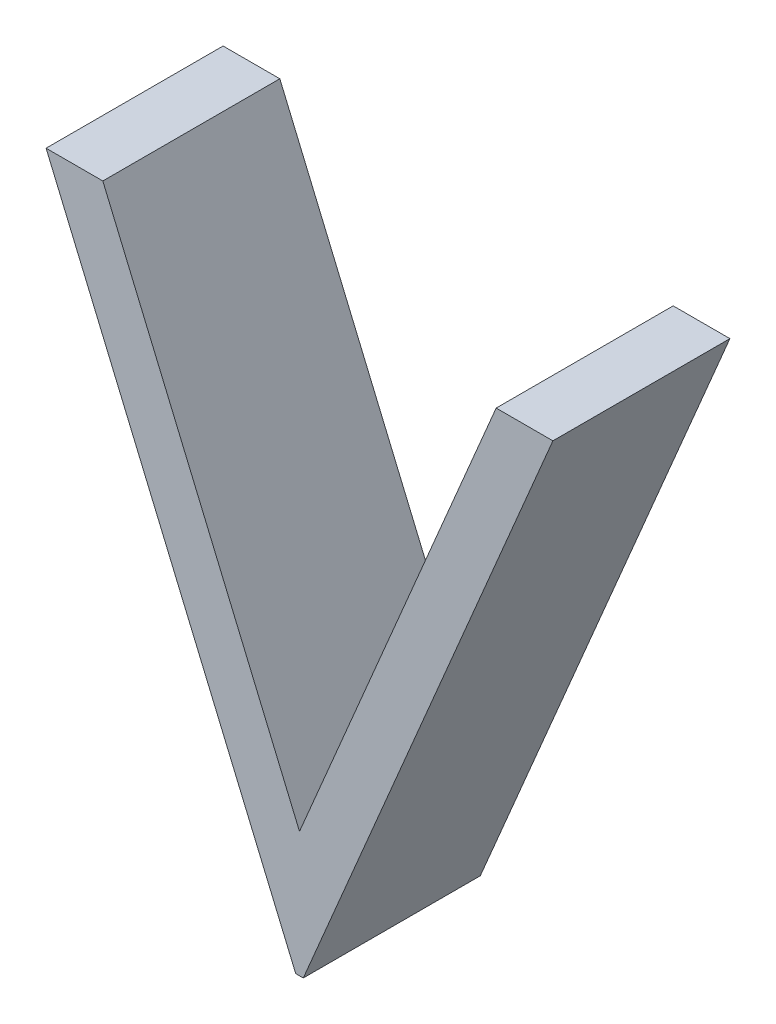
ISO-10303-21;
HEADER;
FILE_DESCRIPTION(('STEP AP214'),'2;1');
FILE_NAME('part.step','',(''),(''),'','','');
FILE_SCHEMA(('AUTOMOTIVE_DESIGN { 1 0 10303 214 1 1 1 1 }'));
ENDSEC;
DATA;
#1=APPLICATION_CONTEXT('core data for automotive mechanical design processes');
#2=APPLICATION_PROTOCOL_DEFINITION('international standard','automotive_design',2000,#1);
#3=PRODUCT_CONTEXT('',#1,'mechanical');
#4=PRODUCT('Part','Part','',(#3));
#5=PRODUCT_RELATED_PRODUCT_CATEGORY('part','',(#4));
#6=PRODUCT_DEFINITION_FORMATION('','',#4);
#7=PRODUCT_DEFINITION_CONTEXT('part definition',#1,'design');
#8=PRODUCT_DEFINITION('design','',#6,#7);
#9=PRODUCT_DEFINITION_SHAPE('','',#8);
#10=(LENGTH_UNIT() NAMED_UNIT(*) SI_UNIT(.MILLI.,.METRE.));
#11=(NAMED_UNIT(*) PLANE_ANGLE_UNIT() SI_UNIT($,.RADIAN.));
#12=(NAMED_UNIT(*) SI_UNIT($,.STERADIAN.) SOLID_ANGLE_UNIT());
#13=UNCERTAINTY_MEASURE_WITH_UNIT(LENGTH_MEASURE(1.E-05),#10,'distance_accuracy_value','');
#14=(GEOMETRIC_REPRESENTATION_CONTEXT(3) GLOBAL_UNCERTAINTY_ASSIGNED_CONTEXT((#13)) GLOBAL_UNIT_ASSIGNED_CONTEXT((#10,
#11,#12)) REPRESENTATION_CONTEXT('',''));
#15=CARTESIAN_POINT('',(0.,0.,0.));
#16=DIRECTION('',(0.,0.,1.));
#17=DIRECTION('',(1.,0.,0.));
#18=AXIS2_PLACEMENT_3D('',#15,#16,#17);
#19=CARTESIAN_POINT('',(-53.7016960951003,-22.8701190762308,1.5));
#20=DIRECTION('',(-0.920967251068559,-0.389639990836697,0.));
#21=DIRECTION('',(0.389639990836697,-0.920967251068559,0.));
#22=AXIS2_PLACEMENT_3D('',#19,#20,#21);
#23=PLANE('',#22);
#24=DIRECTION('',(-0.389639990836697,0.920967251068559,0.));
#25=VECTOR('',#24,1.);
#26=CARTESIAN_POINT('',(-53.7016960951003,-22.8701190762308,0.));
#27=LINE('',#26,#25);
#28=CARTESIAN_POINT('',(-53.7016960951003,-22.8701190762308,0.));
#29=VERTEX_POINT('',#28);
#30=CARTESIAN_POINT('',(-55.8170807104849,-17.8701190762308,0.));
#31=VERTEX_POINT('',#30);
#32=EDGE_CURVE('E124',#29,#31,#27,.T.);
#33=ORIENTED_EDGE('',*,*,#32,.F.);
#34=DIRECTION('',(0.,0.,-1.));
#35=VECTOR('',#34,1.);
#36=CARTESIAN_POINT('',(-53.7016960951003,-22.8701190762308,1.5));
#37=LINE('',#36,#35);
#38=CARTESIAN_POINT('',(-53.7016960951003,-22.8701190762308,1.5));
#39=VERTEX_POINT('',#38);
#40=EDGE_CURVE('E11',#39,#29,#37,.T.);
#41=ORIENTED_EDGE('',*,*,#40,.F.);
#42=DIRECTION('',(-0.389639990836697,0.920967251068559,0.));
#43=VECTOR('',#42,1.);
#44=CARTESIAN_POINT('',(-53.7016960951003,-22.8701190762308,1.5));
#45=LINE('',#44,#43);
#46=CARTESIAN_POINT('',(-55.8170807104849,-17.8701190762308,1.5));
#47=VERTEX_POINT('',#46);
#48=EDGE_CURVE('E141',#39,#47,#45,.T.);
#49=ORIENTED_EDGE('',*,*,#48,.T.);
#50=DIRECTION('',(0.,0.,-1.));
#51=VECTOR('',#50,1.);
#52=CARTESIAN_POINT('',(-55.8170807104849,-17.8701190762308,1.5));
#53=LINE('',#52,#51);
#54=EDGE_CURVE('E36',#47,#31,#53,.T.);
#55=ORIENTED_EDGE('',*,*,#54,.T.);
#56=EDGE_LOOP('',(#33,#41,#49,#55));
#57=FACE_BOUND('',#56,.T.);
#58=ADVANCED_FACE('F33',(#57),#23,.T.);
#59=CARTESIAN_POINT('',(-53.6375935309977,-22.8701190762308,1.5));
#60=DIRECTION('',(0.,-1.,0.));
#61=DIRECTION('',(0.,0.,-1.));
#62=AXIS2_PLACEMENT_3D('',#59,#60,#61);
#63=PLANE('',#62);
#64=DIRECTION('',(-1.,0.,0.));
#65=VECTOR('',#64,1.);
#66=CARTESIAN_POINT('',(-53.6375935309977,-22.8701190762308,0.));
#67=LINE('',#66,#65);
#68=CARTESIAN_POINT('',(-53.6375935309977,-22.8701190762308,0.));
#69=VERTEX_POINT('',#68);
#70=EDGE_CURVE('E139',#69,#29,#67,.T.);
#71=ORIENTED_EDGE('',*,*,#70,.F.);
#72=DIRECTION('',(0.,0.,-1.));
#73=VECTOR('',#72,1.);
#74=CARTESIAN_POINT('',(-53.6375935309977,-22.8701190762308,1.5));
#75=LINE('',#74,#73);
#76=CARTESIAN_POINT('',(-53.6375935309977,-22.8701190762308,1.5));
#77=VERTEX_POINT('',#76);
#78=EDGE_CURVE('E42',#77,#69,#75,.T.);
#79=ORIENTED_EDGE('',*,*,#78,.F.);
#80=DIRECTION('',(-1.,0.,0.));
#81=VECTOR('',#80,1.);
#82=CARTESIAN_POINT('',(-53.6375935309977,-22.8701190762308,1.5));
#83=LINE('',#82,#81);
#84=EDGE_CURVE('E114',#77,#39,#83,.T.);
#85=ORIENTED_EDGE('',*,*,#84,.T.);
#86=ORIENTED_EDGE('',*,*,#40,.T.);
#87=EDGE_LOOP('',(#71,#79,#85,#86));
#88=FACE_BOUND('',#87,.T.);
#89=ADVANCED_FACE('F151',(#88),#63,.T.);
#90=CARTESIAN_POINT('',(-51.5222089156131,-17.8701190762308,1.5));
#91=DIRECTION('',(0.920967251068559,-0.389639990836698,0.));
#92=DIRECTION('',(0.389639990836698,0.920967251068559,0.));
#93=AXIS2_PLACEMENT_3D('',#90,#91,#92);
#94=PLANE('',#93);
#95=DIRECTION('',(-0.389639990836698,-0.920967251068559,0.));
#96=VECTOR('',#95,1.);
#97=CARTESIAN_POINT('',(-51.5222089156131,-17.8701190762308,0.));
#98=LINE('',#97,#96);
#99=CARTESIAN_POINT('',(-51.5222089156131,-17.8701190762308,0.));
#100=VERTEX_POINT('',#99);
#101=EDGE_CURVE('E101',#100,#69,#98,.T.);
#102=ORIENTED_EDGE('',*,*,#101,.F.);
#103=DIRECTION('',(0.,0.,-1.));
#104=VECTOR('',#103,1.);
#105=CARTESIAN_POINT('',(-51.5222089156131,-17.8701190762308,1.5));
#106=LINE('',#105,#104);
#107=CARTESIAN_POINT('',(-51.5222089156131,-17.8701190762308,1.5));
#108=VERTEX_POINT('',#107);
#109=EDGE_CURVE('E96',#108,#100,#106,.T.);
#110=ORIENTED_EDGE('',*,*,#109,.F.);
#111=DIRECTION('',(-0.389639990836698,-0.920967251068559,0.));
#112=VECTOR('',#111,1.);
#113=CARTESIAN_POINT('',(-51.5222089156131,-17.8701190762308,1.5));
#114=LINE('',#113,#112);
#115=EDGE_CURVE('E99',#108,#77,#114,.T.);
#116=ORIENTED_EDGE('',*,*,#115,.T.);
#117=ORIENTED_EDGE('',*,*,#78,.T.);
#118=EDGE_LOOP('',(#102,#110,#116,#117));
#119=FACE_BOUND('',#118,.T.);
#120=ADVANCED_FACE('F98',(#119),#94,.T.);
#121=CARTESIAN_POINT('',(-52.0029781463824,-17.8701190762308,1.5));
#122=DIRECTION('',(0.,1.,0.));
#123=DIRECTION('',(0.,0.,1.));
#124=AXIS2_PLACEMENT_3D('',#121,#122,#123);
#125=PLANE('',#124);
#126=DIRECTION('',(1.,0.,0.));
#127=VECTOR('',#126,1.);
#128=CARTESIAN_POINT('',(-52.0029781463824,-17.8701190762308,0.));
#129=LINE('',#128,#127);
#130=CARTESIAN_POINT('',(-52.0029781463824,-17.8701190762308,0.));
#131=VERTEX_POINT('',#130);
#132=EDGE_CURVE('E136',#131,#100,#129,.T.);
#133=ORIENTED_EDGE('',*,*,#132,.F.);
#134=DIRECTION('',(0.,0.,-1.));
#135=VECTOR('',#134,1.);
#136=CARTESIAN_POINT('',(-52.0029781463824,-17.8701190762308,1.5));
#137=LINE('',#136,#135);
#138=CARTESIAN_POINT('',(-52.0029781463824,-17.8701190762308,1.5));
#139=VERTEX_POINT('',#138);
#140=EDGE_CURVE('E106',#139,#131,#137,.T.);
#141=ORIENTED_EDGE('',*,*,#140,.F.);
#142=DIRECTION('',(1.,0.,0.));
#143=VECTOR('',#142,1.);
#144=CARTESIAN_POINT('',(-52.0029781463824,-17.8701190762308,1.5));
#145=LINE('',#144,#143);
#146=EDGE_CURVE('E112',#139,#108,#145,.T.);
#147=ORIENTED_EDGE('',*,*,#146,.T.);
#148=ORIENTED_EDGE('',*,*,#109,.T.);
#149=EDGE_LOOP('',(#133,#141,#147,#148));
#150=FACE_BOUND('',#149,.T.);
#151=ADVANCED_FACE('F116',(#150),#125,.T.);
#152=CARTESIAN_POINT('',(-53.669644813049,-21.8104235634103,1.5));
#153=DIRECTION('',(-0.920999559573797,0.389563616454195,0.));
#154=DIRECTION('',(-0.389563616454195,-0.920999559573798,0.));
#155=AXIS2_PLACEMENT_3D('',#152,#153,#154);
#156=PLANE('',#155);
#157=DIRECTION('',(0.389563616454195,0.920999559573797,0.));
#158=VECTOR('',#157,1.);
#159=CARTESIAN_POINT('',(-53.669644813049,-21.8104235634103,0.));
#160=LINE('',#159,#158);
#161=CARTESIAN_POINT('',(-53.669644813049,-21.8104235634103,0.));
#162=VERTEX_POINT('',#161);
#163=EDGE_CURVE('E133',#162,#131,#160,.T.);
#164=ORIENTED_EDGE('',*,*,#163,.F.);
#165=DIRECTION('',(0.,0.,-1.));
#166=VECTOR('',#165,1.);
#167=CARTESIAN_POINT('',(-53.669644813049,-21.8104235634103,1.5));
#168=LINE('',#167,#166);
#169=CARTESIAN_POINT('',(-53.669644813049,-21.8104235634103,1.5));
#170=VERTEX_POINT('',#169);
#171=EDGE_CURVE('E145',#170,#162,#168,.T.);
#172=ORIENTED_EDGE('',*,*,#171,.F.);
#173=DIRECTION('',(0.389563616454195,0.920999559573797,0.));
#174=VECTOR('',#173,1.);
#175=CARTESIAN_POINT('',(-53.669644813049,-21.8104235634103,1.5));
#176=LINE('',#175,#174);
#177=EDGE_CURVE('E117',#170,#139,#176,.T.);
#178=ORIENTED_EDGE('',*,*,#177,.T.);
#179=ORIENTED_EDGE('',*,*,#140,.T.);
#180=EDGE_LOOP('',(#164,#172,#178,#179));
#181=FACE_BOUND('',#180,.T.);
#182=ADVANCED_FACE('F164',(#181),#156,.T.);
#183=CARTESIAN_POINT('',(-55.3363114797157,-17.8701190762308,1.5));
#184=DIRECTION('',(0.920999559573798,0.389563616454194,0.));
#185=DIRECTION('',(-0.389563616454194,0.920999559573798,0.));
#186=AXIS2_PLACEMENT_3D('',#183,#184,#185);
#187=PLANE('',#186);
#188=DIRECTION('',(0.389563616454194,-0.920999559573798,0.));
#189=VECTOR('',#188,1.);
#190=CARTESIAN_POINT('',(-55.3363114797157,-17.8701190762308,0.));
#191=LINE('',#190,#189);
#192=CARTESIAN_POINT('',(-55.3363114797157,-17.8701190762308,0.));
#193=VERTEX_POINT('',#192);
#194=EDGE_CURVE('E130',#193,#162,#191,.T.);
#195=ORIENTED_EDGE('',*,*,#194,.F.);
#196=DIRECTION('',(0.,0.,-1.));
#197=VECTOR('',#196,1.);
#198=CARTESIAN_POINT('',(-55.3363114797157,-17.8701190762308,1.5));
#199=LINE('',#198,#197);
#200=CARTESIAN_POINT('',(-55.3363114797157,-17.8701190762308,1.5));
#201=VERTEX_POINT('',#200);
#202=EDGE_CURVE('E146',#201,#193,#199,.T.);
#203=ORIENTED_EDGE('',*,*,#202,.F.);
#204=DIRECTION('',(0.389563616454194,-0.920999559573798,0.));
#205=VECTOR('',#204,1.);
#206=CARTESIAN_POINT('',(-55.3363114797157,-17.8701190762308,1.5));
#207=LINE('',#206,#205);
#208=EDGE_CURVE('E119',#201,#170,#207,.T.);
#209=ORIENTED_EDGE('',*,*,#208,.T.);
#210=ORIENTED_EDGE('',*,*,#171,.T.);
#211=EDGE_LOOP('',(#195,#203,#209,#210));
#212=FACE_BOUND('',#211,.T.);
#213=ADVANCED_FACE('F167',(#212),#187,.T.);
#214=CARTESIAN_POINT('',(-55.8170807104849,-17.8701190762308,1.5));
#215=DIRECTION('',(0.,1.,0.));
#216=DIRECTION('',(0.,0.,1.));
#217=AXIS2_PLACEMENT_3D('',#214,#215,#216);
#218=PLANE('',#217);
#219=DIRECTION('',(1.,0.,0.));
#220=VECTOR('',#219,1.);
#221=CARTESIAN_POINT('',(-55.8170807104849,-17.8701190762308,0.));
#222=LINE('',#221,#220);
#223=EDGE_CURVE('E127',#31,#193,#222,.T.);
#224=ORIENTED_EDGE('',*,*,#223,.F.);
#225=ORIENTED_EDGE('',*,*,#54,.F.);
#226=DIRECTION('',(1.,0.,0.));
#227=VECTOR('',#226,1.);
#228=CARTESIAN_POINT('',(-55.8170807104849,-17.8701190762308,1.5));
#229=LINE('',#228,#227);
#230=EDGE_CURVE('E265',#47,#201,#229,.T.);
#231=ORIENTED_EDGE('',*,*,#230,.T.);
#232=ORIENTED_EDGE('',*,*,#202,.T.);
#233=EDGE_LOOP('',(#224,#225,#231,#232));
#234=FACE_BOUND('',#233,.T.);
#235=ADVANCED_FACE('F148',(#234),#218,.T.);
#236=CARTESIAN_POINT('',(0.,0.,1.5));
#237=DIRECTION('',(0.,0.,-1.));
#238=DIRECTION('',(-1.,0.,0.));
#239=AXIS2_PLACEMENT_3D('',#236,#237,#238);
#240=PLANE('',#239);
#241=ORIENTED_EDGE('',*,*,#48,.F.);
#242=ORIENTED_EDGE('',*,*,#84,.F.);
#243=ORIENTED_EDGE('',*,*,#115,.F.);
#244=ORIENTED_EDGE('',*,*,#146,.F.);
#245=ORIENTED_EDGE('',*,*,#177,.F.);
#246=ORIENTED_EDGE('',*,*,#208,.F.);
#247=ORIENTED_EDGE('',*,*,#230,.F.);
#248=EDGE_LOOP('',(#241,#242,#243,#244,#245,#246,#247));
#249=FACE_BOUND('',#248,.T.);
#250=ADVANCED_FACE('F110',(#249),#240,.F.);
#251=CARTESIAN_POINT('',(0.,0.,0.));
#252=DIRECTION('',(0.,0.,-1.));
#253=DIRECTION('',(-1.,0.,0.));
#254=AXIS2_PLACEMENT_3D('',#251,#252,#253);
#255=PLANE('',#254);
#256=ORIENTED_EDGE('',*,*,#32,.T.);
#257=ORIENTED_EDGE('',*,*,#223,.T.);
#258=ORIENTED_EDGE('',*,*,#194,.T.);
#259=ORIENTED_EDGE('',*,*,#163,.T.);
#260=ORIENTED_EDGE('',*,*,#132,.T.);
#261=ORIENTED_EDGE('',*,*,#101,.T.);
#262=ORIENTED_EDGE('',*,*,#70,.T.);
#263=EDGE_LOOP('',(#256,#257,#258,#259,#260,#261,#262));
#264=FACE_BOUND('',#263,.T.);
#265=ADVANCED_FACE('F150',(#264),#255,.T.);
#266=CLOSED_SHELL('',(#58,#89,#120,#151,#182,#213,#235,#250,#265));
#267=MANIFOLD_SOLID_BREP('B2',#266);
#268=ADVANCED_BREP_SHAPE_REPRESENTATION('',(#18,#267),#14);
#269=SHAPE_DEFINITION_REPRESENTATION(#9,#268);
ENDSEC;
END-ISO-10303-21;
